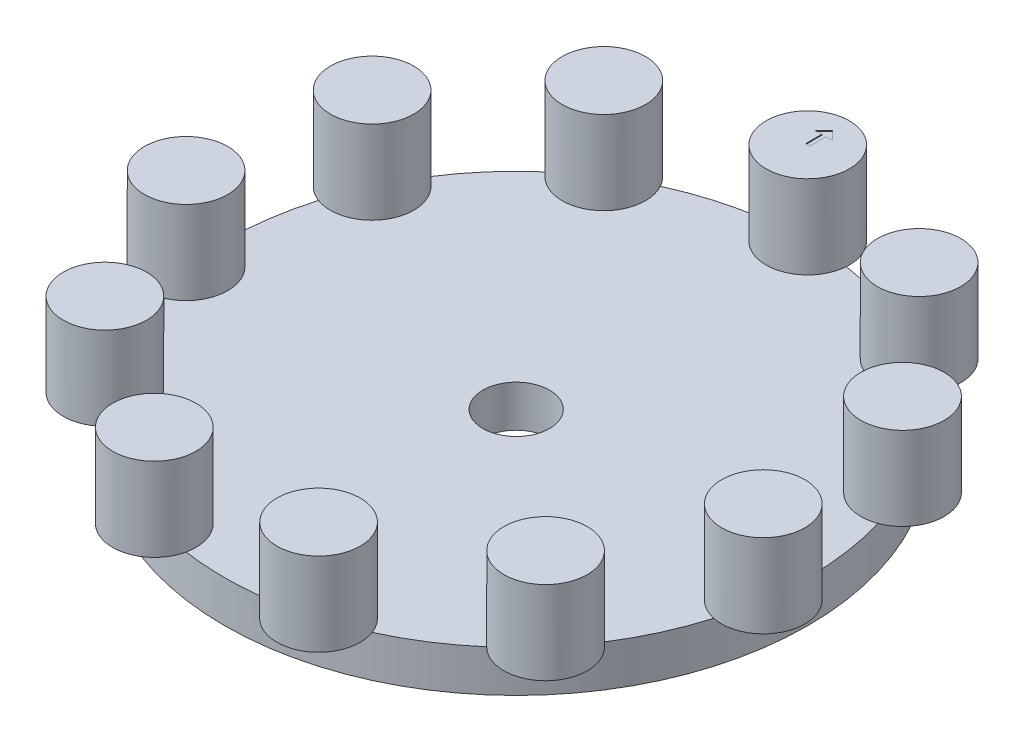
ISO-10303-21;
HEADER;
FILE_DESCRIPTION(('STEP AP214'),'2;1');
FILE_NAME('part.step','',(''),(''),'','','');
FILE_SCHEMA(('AUTOMOTIVE_DESIGN { 1 0 10303 214 1 1 1 1 }'));
ENDSEC;
DATA;
#1=APPLICATION_CONTEXT('core data for automotive mechanical design processes');
#2=APPLICATION_PROTOCOL_DEFINITION('international standard','automotive_design',2000,#1);
#3=PRODUCT_CONTEXT('',#1,'mechanical');
#4=PRODUCT('Part','Part','',(#3));
#5=PRODUCT_RELATED_PRODUCT_CATEGORY('part','',(#4));
#6=PRODUCT_DEFINITION_FORMATION('','',#4);
#7=PRODUCT_DEFINITION_CONTEXT('part definition',#1,'design');
#8=PRODUCT_DEFINITION('design','',#6,#7);
#9=PRODUCT_DEFINITION_SHAPE('','',#8);
#10=(LENGTH_UNIT() NAMED_UNIT(*) SI_UNIT(.MILLI.,.METRE.));
#11=(NAMED_UNIT(*) PLANE_ANGLE_UNIT() SI_UNIT($,.RADIAN.));
#12=(NAMED_UNIT(*) SI_UNIT($,.STERADIAN.) SOLID_ANGLE_UNIT());
#13=UNCERTAINTY_MEASURE_WITH_UNIT(LENGTH_MEASURE(1.E-05),#10,'distance_accuracy_value','');
#14=(GEOMETRIC_REPRESENTATION_CONTEXT(3) GLOBAL_UNCERTAINTY_ASSIGNED_CONTEXT((#13)) GLOBAL_UNIT_ASSIGNED_CONTEXT((#10,
#11,#12)) REPRESENTATION_CONTEXT('',''));
#15=CARTESIAN_POINT('',(0.,0.,0.));
#16=DIRECTION('',(0.,0.,1.));
#17=DIRECTION('',(1.,0.,0.));
#18=AXIS2_PLACEMENT_3D('',#15,#16,#17);
#19=CARTESIAN_POINT('',(0.,10.,0.));
#20=DIRECTION('',(0.,1.,0.));
#21=DIRECTION('',(0.,0.,1.));
#22=AXIS2_PLACEMENT_3D('',#19,#20,#21);
#23=PLANE('',#22);
#24=CARTESIAN_POINT('',(0.,10.,-35.));
#25=DIRECTION('',(0.,1.,0.));
#26=DIRECTION('',(0.,0.,1.));
#27=AXIS2_PLACEMENT_3D('',#24,#25,#26);
#28=CIRCLE('',#27,5.);
#29=CARTESIAN_POINT('',(0.,10.,-30.));
#30=VERTEX_POINT('',#29);
#31=EDGE_CURVE('E11',#30,#30,#28,.T.);
#32=ORIENTED_EDGE('',*,*,#31,.T.);
#33=EDGE_LOOP('',(#32));
#34=FACE_BOUND('',#33,.T.);
#35=DIRECTION('',(0.,0.,-1.));
#36=VECTOR('',#35,1.);
#37=CARTESIAN_POINT('',(-0.25,10.,0.));
#38=LINE('',#37,#36);
#39=CARTESIAN_POINT('',(-0.25,10.,-35.));
#40=VERTEX_POINT('',#39);
#41=CARTESIAN_POINT('',(-0.25,10.,-36.9393398282202));
#42=VERTEX_POINT('',#41);
#43=EDGE_CURVE('E219',#40,#42,#38,.T.);
#44=ORIENTED_EDGE('',*,*,#43,.T.);
#45=DIRECTION('',(-1.,0.,0.));
#46=VECTOR('',#45,1.);
#47=CARTESIAN_POINT('',(0.,10.,-36.9393398282202));
#48=LINE('',#47,#46);
#49=CARTESIAN_POINT('',(-1.06066017177979,10.,-36.9393398282202));
#50=VERTEX_POINT('',#49);
#51=EDGE_CURVE('E62',#42,#50,#48,.T.);
#52=ORIENTED_EDGE('',*,*,#51,.T.);
#53=DIRECTION('',(0.707106781186542,0.,-0.707106781186553));
#54=VECTOR('',#53,1.);
#55=CARTESIAN_POINT('',(-19.,10.,-18.9999999999997));
#56=LINE('',#55,#54);
#57=CARTESIAN_POINT('',(0.,10.,-38.));
#58=VERTEX_POINT('',#57);
#59=EDGE_CURVE('E196',#50,#58,#56,.T.);
#60=ORIENTED_EDGE('',*,*,#59,.T.);
#61=DIRECTION('',(0.707106781186554,0.,0.707106781186541));
#62=VECTOR('',#61,1.);
#63=CARTESIAN_POINT('',(19.,10.,-19.0000000000003));
#64=LINE('',#63,#62);
#65=CARTESIAN_POINT('',(1.06066017177983,10.,-36.9393398282202));
#66=VERTEX_POINT('',#65);
#67=EDGE_CURVE('E200',#58,#66,#64,.T.);
#68=ORIENTED_EDGE('',*,*,#67,.T.);
#69=DIRECTION('',(-1.,0.,0.));
#70=VECTOR('',#69,1.);
#71=CARTESIAN_POINT('',(0.,10.,-36.9393398282202));
#72=LINE('',#71,#70);
#73=CARTESIAN_POINT('',(0.25,10.,-36.9393398282202));
#74=VERTEX_POINT('',#73);
#75=EDGE_CURVE('E230',#66,#74,#72,.T.);
#76=ORIENTED_EDGE('',*,*,#75,.T.);
#77=DIRECTION('',(0.,0.,-1.));
#78=VECTOR('',#77,1.);
#79=CARTESIAN_POINT('',(0.25,10.,0.));
#80=LINE('',#79,#78);
#81=CARTESIAN_POINT('',(0.25,10.,-35.));
#82=VERTEX_POINT('',#81);
#83=EDGE_CURVE('E226',#82,#74,#80,.T.);
#84=ORIENTED_EDGE('',*,*,#83,.F.);
#85=DIRECTION('',(1.,0.,0.));
#86=VECTOR('',#85,1.);
#87=CARTESIAN_POINT('',(0.,10.,-35.));
#88=LINE('',#87,#86);
#89=EDGE_CURVE('E222',#40,#82,#88,.T.);
#90=ORIENTED_EDGE('',*,*,#89,.F.);
#91=EDGE_LOOP('',(#44,#52,#60,#68,#76,#84,#90));
#92=FACE_BOUND('',#91,.T.);
#93=ADVANCED_FACE('F46',(#34,#92),#23,.T.);
#94=CARTESIAN_POINT('',(0.,10.,-35.));
#95=DIRECTION('',(0.,-1.,0.));
#96=DIRECTION('',(0.,0.,-1.));
#97=AXIS2_PLACEMENT_3D('',#94,#95,#96);
#98=CYLINDRICAL_SURFACE('',#97,5.);
#99=ORIENTED_EDGE('',*,*,#31,.F.);
#100=EDGE_LOOP('',(#99));
#101=FACE_BOUND('',#100,.T.);
#102=CARTESIAN_POINT('',(0.,0.,-35.));
#103=DIRECTION('',(0.,1.,0.));
#104=DIRECTION('',(0.,0.,1.));
#105=AXIS2_PLACEMENT_3D('',#102,#103,#104);
#106=CIRCLE('',#105,5.);
#107=CARTESIAN_POINT('',(4.98722858706045,0.,-34.6428571428587));
#108=VERTEX_POINT('',#107);
#109=CARTESIAN_POINT('',(-4.98722858706045,0.,-34.6428571428587));
#110=VERTEX_POINT('',#109);
#111=EDGE_CURVE('E50',#108,#110,#106,.T.);
#112=ORIENTED_EDGE('',*,*,#111,.T.);
#113=EDGE_CURVE('E357',#110,#108,#106,.T.);
#114=ORIENTED_EDGE('',*,*,#113,.T.);
#115=EDGE_LOOP('',(#112,#114));
#116=FACE_BOUND('',#115,.T.);
#117=ADVANCED_FACE('F48',(#101,#116),#98,.T.);
#118=CARTESIAN_POINT('',(0.,0.,0.));
#119=DIRECTION('',(0.,1.,0.));
#120=DIRECTION('',(0.,0.,1.));
#121=AXIS2_PLACEMENT_3D('',#118,#119,#120);
#122=PLANE('',#121);
#123=ORIENTED_EDGE('',*,*,#111,.F.);
#124=CARTESIAN_POINT('',(0.,0.,0.));
#125=DIRECTION('',(0.,1.,0.));
#126=DIRECTION('',(0.,0.,1.));
#127=AXIS2_PLACEMENT_3D('',#124,#125,#126);
#128=CIRCLE('',#127,35.0000000000015);
#129=EDGE_CURVE('E358',#108,#110,#128,.T.);
#130=ORIENTED_EDGE('',*,*,#129,.T.);
#131=EDGE_LOOP('',(#123,#130));
#132=FACE_BOUND('',#131,.T.);
#133=ADVANCED_FACE('F450',(#132),#122,.F.);
#134=CARTESIAN_POINT('',(0.,0.,0.));
#135=DIRECTION('',(0.,1.,0.));
#136=DIRECTION('',(0.,0.,1.));
#137=AXIS2_PLACEMENT_3D('',#134,#135,#136);
#138=PLANE('',#137);
#139=CARTESIAN_POINT('',(0.,0.,0.));
#140=DIRECTION('',(0.,1.,0.));
#141=DIRECTION('',(0.,0.,1.));
#142=AXIS2_PLACEMENT_3D('',#139,#140,#141);
#143=CIRCLE('',#142,4.);
#144=CARTESIAN_POINT('',(0.,0.,4.));
#145=VERTEX_POINT('',#144);
#146=EDGE_CURVE('E340',#145,#145,#143,.T.);
#147=ORIENTED_EDGE('',*,*,#146,.F.);
#148=EDGE_LOOP('',(#147));
#149=FACE_BOUND('',#148,.T.);
#150=CARTESIAN_POINT('',(-14.5338189368116,0.,-31.8397252989419));
#151=VERTEX_POINT('',#150);
#152=EDGE_CURVE('E361',#110,#151,#128,.T.);
#153=ORIENTED_EDGE('',*,*,#152,.T.);
#154=CARTESIAN_POINT('',(-18.9224286109455,0.,-29.4438736490898));
#155=DIRECTION('',(0.,1.,0.));
#156=DIRECTION('',(0.,0.,1.));
#157=AXIS2_PLACEMENT_3D('',#154,#155,#156);
#158=CIRCLE('',#157,5.);
#159=CARTESIAN_POINT('',(-22.9248662726143,0.,-26.4471266186491));
#160=VERTEX_POINT('',#159);
#161=EDGE_CURVE('E240',#160,#151,#158,.T.);
#162=ORIENTED_EDGE('',*,*,#161,.F.);
#163=CARTESIAN_POINT('',(-29.4404816393038,0.,-18.9277056413588));
#164=VERTEX_POINT('',#163);
#165=EDGE_CURVE('E362',#160,#164,#128,.T.);
#166=ORIENTED_EDGE('',*,*,#165,.T.);
#167=CARTESIAN_POINT('',(-31.8371198374065,0.,-14.5395254550634));
#168=DIRECTION('',(0.,1.,0.));
#169=DIRECTION('',(0.,0.,1.));
#170=AXIS2_PLACEMENT_3D('',#167,#168,#169);
#171=CIRCLE('',#170,5.);
#172=CARTESIAN_POINT('',(-33.5840208959777,0.,-9.85462025948447));
#173=VERTEX_POINT('',#172);
#174=EDGE_CURVE('E259',#173,#164,#171,.T.);
#175=ORIENTED_EDGE('',*,*,#174,.F.);
#176=CARTESIAN_POINT('',(-34.999999437819,0.,-0.0062731794204891));
#177=VERTEX_POINT('',#176);
#178=EDGE_CURVE('E377',#173,#177,#128,.T.);
#179=ORIENTED_EDGE('',*,*,#178,.T.);
#180=CARTESIAN_POINT('',(-34.6437504658294,0.,4.98101933956779));
#181=DIRECTION('',(0.,1.,0.));
#182=DIRECTION('',(0.,0.,1.));
#183=AXIS2_PLACEMENT_3D('',#180,#181,#182);
#184=CIRCLE('',#183,5.);
#185=CARTESIAN_POINT('',(-33.5804861782192,0.,9.86665840264773));
#186=VERTEX_POINT('',#185);
#187=EDGE_CURVE('E278',#186,#177,#184,.T.);
#188=ORIENTED_EDGE('',*,*,#187,.F.);
#189=CARTESIAN_POINT('',(-29.4472647130037,0.,18.9171509726596));
#190=VERTEX_POINT('',#189);
#191=EDGE_CURVE('E379',#186,#190,#128,.T.);
#192=ORIENTED_EDGE('',*,*,#191,.T.);
#193=CARTESIAN_POINT('',(-26.4512351023944,0.,22.9201256880871));
#194=DIRECTION('',(0.,1.,0.));
#195=DIRECTION('',(0.,0.,1.));
#196=AXIS2_PLACEMENT_3D('',#193,#194,#195);
#197=CIRCLE('',#196,5.);
#198=CARTESIAN_POINT('',(-22.9153843672519,0.,26.4553427364156));
#199=VERTEX_POINT('',#198);
#200=EDGE_CURVE('E287',#199,#190,#197,.T.);
#201=ORIENTED_EDGE('',*,*,#200,.F.);
#202=CARTESIAN_POINT('',(-14.5452315062388,0.,31.8345133531208));
#203=VERTEX_POINT('',#202);
#204=EDGE_CURVE('E392',#199,#203,#128,.T.);
#205=ORIENTED_EDGE('',*,*,#204,.T.);
#206=CARTESIAN_POINT('',(-9.86063948944448,0.,33.5822540765082));
#207=DIRECTION('',(0.,1.,0.));
#208=DIRECTION('',(0.,0.,1.));
#209=AXIS2_PLACEMENT_3D('',#206,#207,#208);
#210=CIRCLE('',#209,5.);
#211=CARTESIAN_POINT('',(-4.97480993205055,0.,34.6446426758897));
#212=VERTEX_POINT('',#211);
#213=EDGE_CURVE('E296',#212,#203,#210,.T.);
#214=ORIENTED_EDGE('',*,*,#213,.F.);
#215=CARTESIAN_POINT('',(4.97480993206165,0.,34.6446426758881));
#216=VERTEX_POINT('',#215);
#217=EDGE_CURVE('E394',#212,#216,#128,.T.);
#218=ORIENTED_EDGE('',*,*,#217,.T.);
#219=CARTESIAN_POINT('',(9.86063948945559,0.,33.5822540765066));
#220=DIRECTION('',(0.,1.,0.));
#221=DIRECTION('',(0.,0.,1.));
#222=AXIS2_PLACEMENT_3D('',#219,#220,#221);
#223=CIRCLE('',#222,5.00000000000001);
#224=CARTESIAN_POINT('',(14.5452315062488,0.,31.8345133531162));
#225=VERTEX_POINT('',#224);
#226=EDGE_CURVE('E305',#225,#216,#223,.T.);
#227=ORIENTED_EDGE('',*,*,#226,.F.);
#228=CARTESIAN_POINT('',(22.9153843672592,0.,26.4553427364093));
#229=VERTEX_POINT('',#228);
#230=EDGE_CURVE('E408',#225,#229,#128,.T.);
#231=ORIENTED_EDGE('',*,*,#230,.T.);
#232=CARTESIAN_POINT('',(26.4512351024037,0.,22.9201256880828));
#233=DIRECTION('',(0.,1.,0.));
#234=DIRECTION('',(0.,0.,1.));
#235=AXIS2_PLACEMENT_3D('',#232,#233,#234);
#236=CIRCLE('',#235,5.);
#237=CARTESIAN_POINT('',(29.4472647130086,0.,18.917150972652));
#238=VERTEX_POINT('',#237);
#239=EDGE_CURVE('E314',#238,#229,#236,.T.);
#240=ORIENTED_EDGE('',*,*,#239,.F.);
#241=CARTESIAN_POINT('',(33.5804861782211,0.,9.86665840264113));
#242=VERTEX_POINT('',#241);
#243=EDGE_CURVE('E410',#238,#242,#128,.T.);
#244=ORIENTED_EDGE('',*,*,#243,.T.);
#245=CARTESIAN_POINT('',(34.6437504658359,0.,4.98101933956217));
#246=DIRECTION('',(0.,1.,0.));
#247=DIRECTION('',(0.,0.,1.));
#248=AXIS2_PLACEMENT_3D('',#245,#246,#247);
#249=CIRCLE('',#248,5.);
#250=CARTESIAN_POINT('',(34.999999437819,0.,-0.00627317942655803));
#251=VERTEX_POINT('',#250);
#252=EDGE_CURVE('E323',#251,#242,#249,.T.);
#253=ORIENTED_EDGE('',*,*,#252,.F.);
#254=CARTESIAN_POINT('',(33.5840208959766,0.,-9.85462025948802));
#255=VERTEX_POINT('',#254);
#256=EDGE_CURVE('E424',#251,#255,#128,.T.);
#257=ORIENTED_EDGE('',*,*,#256,.T.);
#258=CARTESIAN_POINT('',(31.8371198374098,0.,-14.5395254550686));
#259=DIRECTION('',(0.,1.,0.));
#260=DIRECTION('',(0.,0.,1.));
#261=AXIS2_PLACEMENT_3D('',#258,#259,#260);
#262=CIRCLE('',#261,4.99999999999999);
#263=CARTESIAN_POINT('',(29.4404816393022,0.,-18.9277056413613));
#264=VERTEX_POINT('',#263);
#265=EDGE_CURVE('E322',#264,#255,#262,.T.);
#266=ORIENTED_EDGE('',*,*,#265,.F.);
#267=CARTESIAN_POINT('',(22.9248662726135,0.,-26.4471266186499));
#268=VERTEX_POINT('',#267);
#269=EDGE_CURVE('E426',#264,#268,#128,.T.);
#270=ORIENTED_EDGE('',*,*,#269,.T.);
#271=CARTESIAN_POINT('',(18.9224286109464,0.,-29.4438736490929));
#272=DIRECTION('',(0.,1.,0.));
#273=DIRECTION('',(0.,0.,1.));
#274=AXIS2_PLACEMENT_3D('',#271,#272,#273);
#275=CIRCLE('',#274,5.);
#276=CARTESIAN_POINT('',(14.5338189368111,0.,-31.8397252989422));
#277=VERTEX_POINT('',#276);
#278=EDGE_CURVE('E331',#277,#268,#275,.T.);
#279=ORIENTED_EDGE('',*,*,#278,.F.);
#280=EDGE_CURVE('E349',#277,#108,#128,.T.);
#281=ORIENTED_EDGE('',*,*,#280,.T.);
#282=ORIENTED_EDGE('',*,*,#113,.F.);
#283=EDGE_LOOP('',(#153,#162,#166,#175,#179,#188,#192,#201,#205,#214,#218,#227,#231,#240,#244,
#253,#257,#266,#270,#279,#281,#282));
#284=FACE_BOUND('',#283,.T.);
#285=ADVANCED_FACE('F444',(#149,#284),#138,.T.);
#286=CARTESIAN_POINT('',(0.,-5.,0.));
#287=DIRECTION('',(0.,1.,0.));
#288=DIRECTION('',(0.,0.,1.));
#289=AXIS2_PLACEMENT_3D('',#286,#287,#288);
#290=CYLINDRICAL_SURFACE('',#289,35.0000000000015);
#291=CARTESIAN_POINT('',(0.,-5.,0.));
#292=DIRECTION('',(0.,1.,0.));
#293=DIRECTION('',(0.,0.,1.));
#294=AXIS2_PLACEMENT_3D('',#291,#292,#293);
#295=CIRCLE('',#294,35.0000000000015);
#296=CARTESIAN_POINT('',(0.,-5.,35.0000000000015));
#297=VERTEX_POINT('',#296);
#298=EDGE_CURVE('E353',#297,#297,#295,.T.);
#299=ORIENTED_EDGE('',*,*,#298,.T.);
#300=EDGE_LOOP('',(#299));
#301=FACE_BOUND('',#300,.T.);
#302=ORIENTED_EDGE('',*,*,#129,.F.);
#303=ORIENTED_EDGE('',*,*,#280,.F.);
#304=EDGE_CURVE('E368',#268,#277,#128,.T.);
#305=ORIENTED_EDGE('',*,*,#304,.F.);
#306=ORIENTED_EDGE('',*,*,#269,.F.);
#307=EDGE_CURVE('E431',#255,#264,#128,.T.);
#308=ORIENTED_EDGE('',*,*,#307,.F.);
#309=ORIENTED_EDGE('',*,*,#256,.F.);
#310=EDGE_CURVE('E417',#242,#251,#128,.T.);
#311=ORIENTED_EDGE('',*,*,#310,.F.);
#312=ORIENTED_EDGE('',*,*,#243,.F.);
#313=EDGE_CURVE('E415',#229,#238,#128,.T.);
#314=ORIENTED_EDGE('',*,*,#313,.F.);
#315=ORIENTED_EDGE('',*,*,#230,.F.);
#316=EDGE_CURVE('E401',#216,#225,#128,.T.);
#317=ORIENTED_EDGE('',*,*,#316,.F.);
#318=ORIENTED_EDGE('',*,*,#217,.F.);
#319=EDGE_CURVE('E399',#203,#212,#128,.T.);
#320=ORIENTED_EDGE('',*,*,#319,.F.);
#321=ORIENTED_EDGE('',*,*,#204,.F.);
#322=EDGE_CURVE('E385',#190,#199,#128,.T.);
#323=ORIENTED_EDGE('',*,*,#322,.F.);
#324=ORIENTED_EDGE('',*,*,#191,.F.);
#325=EDGE_CURVE('E383',#177,#186,#128,.T.);
#326=ORIENTED_EDGE('',*,*,#325,.F.);
#327=ORIENTED_EDGE('',*,*,#178,.F.);
#328=EDGE_CURVE('E370',#164,#173,#128,.T.);
#329=ORIENTED_EDGE('',*,*,#328,.F.);
#330=ORIENTED_EDGE('',*,*,#165,.F.);
#331=EDGE_CURVE('E70',#151,#160,#128,.T.);
#332=ORIENTED_EDGE('',*,*,#331,.F.);
#333=ORIENTED_EDGE('',*,*,#152,.F.);
#334=EDGE_LOOP('',(#302,#303,#305,#306,#308,#309,#311,#312,#314,#315,#317,#318,#320,#321,#323,
#324,#326,#327,#329,#330,#332,#333));
#335=FACE_BOUND('',#334,.T.);
#336=ADVANCED_FACE('F447',(#301,#335),#290,.T.);
#337=CARTESIAN_POINT('',(0.,-5.,0.));
#338=DIRECTION('',(0.,1.,0.));
#339=DIRECTION('',(0.,0.,1.));
#340=AXIS2_PLACEMENT_3D('',#337,#338,#339);
#341=PLANE('',#340);
#342=CARTESIAN_POINT('',(0.,-5.,0.));
#343=DIRECTION('',(0.,1.,0.));
#344=DIRECTION('',(0.,0.,1.));
#345=AXIS2_PLACEMENT_3D('',#342,#343,#344);
#346=CIRCLE('',#345,4.);
#347=CARTESIAN_POINT('',(0.,-5.,4.));
#348=VERTEX_POINT('',#347);
#349=EDGE_CURVE('E345',#348,#348,#346,.T.);
#350=ORIENTED_EDGE('',*,*,#349,.T.);
#351=EDGE_LOOP('',(#350));
#352=FACE_BOUND('',#351,.T.);
#353=ORIENTED_EDGE('',*,*,#298,.F.);
#354=EDGE_LOOP('',(#353));
#355=FACE_BOUND('',#354,.T.);
#356=ADVANCED_FACE('F470',(#352,#355),#341,.F.);
#357=CARTESIAN_POINT('',(0.,-5.,0.));
#358=DIRECTION('',(0.,1.,0.));
#359=DIRECTION('',(0.,0.,1.));
#360=AXIS2_PLACEMENT_3D('',#357,#358,#359);
#361=CYLINDRICAL_SURFACE('',#360,4.);
#362=ORIENTED_EDGE('',*,*,#349,.F.);
#363=EDGE_LOOP('',(#362));
#364=FACE_BOUND('',#363,.T.);
#365=ORIENTED_EDGE('',*,*,#146,.T.);
#366=EDGE_LOOP('',(#365));
#367=FACE_BOUND('',#366,.T.);
#368=ADVANCED_FACE('F475',(#364,#367),#361,.F.);
#369=CARTESIAN_POINT('',(18.9224286109464,10.,-29.4438736490929));
#370=DIRECTION('',(0.,-1.,0.));
#371=DIRECTION('',(0.,0.,-1.));
#372=AXIS2_PLACEMENT_3D('',#369,#370,#371);
#373=CYLINDRICAL_SURFACE('',#372,5.);
#374=CARTESIAN_POINT('',(18.9224286109464,10.,-29.4438736490929));
#375=DIRECTION('',(0.,1.,0.));
#376=DIRECTION('',(0.,0.,1.));
#377=AXIS2_PLACEMENT_3D('',#374,#375,#376);
#378=CIRCLE('',#377,5.);
#379=CARTESIAN_POINT('',(18.9224286109464,10.,-24.4438736490929));
#380=VERTEX_POINT('',#379);
#381=EDGE_CURVE('E336',#380,#380,#378,.T.);
#382=ORIENTED_EDGE('',*,*,#381,.F.);
#383=EDGE_LOOP('',(#382));
#384=FACE_BOUND('',#383,.T.);
#385=EDGE_CURVE('E341',#268,#277,#275,.T.);
#386=ORIENTED_EDGE('',*,*,#385,.T.);
#387=ORIENTED_EDGE('',*,*,#278,.T.);
#388=EDGE_LOOP('',(#386,#387));
#389=FACE_BOUND('',#388,.T.);
#390=ADVANCED_FACE('F479',(#384,#389),#373,.T.);
#391=CARTESIAN_POINT('',(0.,10.,0.));
#392=DIRECTION('',(0.,1.,0.));
#393=DIRECTION('',(0.,0.,1.));
#394=AXIS2_PLACEMENT_3D('',#391,#392,#393);
#395=PLANE('',#394);
#396=ORIENTED_EDGE('',*,*,#381,.T.);
#397=EDGE_LOOP('',(#396));
#398=FACE_BOUND('',#397,.T.);
#399=ADVANCED_FACE('F483',(#398),#395,.T.);
#400=CARTESIAN_POINT('',(0.,0.,0.));
#401=DIRECTION('',(0.,1.,0.));
#402=DIRECTION('',(0.,0.,1.));
#403=AXIS2_PLACEMENT_3D('',#400,#401,#402);
#404=PLANE('',#403);
#405=ORIENTED_EDGE('',*,*,#304,.T.);
#406=ORIENTED_EDGE('',*,*,#385,.F.);
#407=EDGE_LOOP('',(#405,#406));
#408=FACE_BOUND('',#407,.T.);
#409=ADVANCED_FACE('F485',(#408),#404,.F.);
#410=CARTESIAN_POINT('',(31.8371198374098,10.,-14.5395254550686));
#411=DIRECTION('',(0.,-1.,0.));
#412=DIRECTION('',(0.,0.,-1.));
#413=AXIS2_PLACEMENT_3D('',#410,#411,#412);
#414=CYLINDRICAL_SURFACE('',#413,4.99999999999999);
#415=CARTESIAN_POINT('',(31.8371198374098,10.,-14.5395254550686));
#416=DIRECTION('',(0.,1.,0.));
#417=DIRECTION('',(0.,0.,1.));
#418=AXIS2_PLACEMENT_3D('',#415,#416,#417);
#419=CIRCLE('',#418,4.99999999999999);
#420=CARTESIAN_POINT('',(31.8371198374098,10.,-9.53952545506861));
#421=VERTEX_POINT('',#420);
#422=EDGE_CURVE('E327',#421,#421,#419,.T.);
#423=ORIENTED_EDGE('',*,*,#422,.F.);
#424=EDGE_LOOP('',(#423));
#425=FACE_BOUND('',#424,.T.);
#426=EDGE_CURVE('E332',#255,#264,#262,.T.);
#427=ORIENTED_EDGE('',*,*,#426,.T.);
#428=ORIENTED_EDGE('',*,*,#265,.T.);
#429=EDGE_LOOP('',(#427,#428));
#430=FACE_BOUND('',#429,.T.);
#431=ADVANCED_FACE('F488',(#425,#430),#414,.T.);
#432=CARTESIAN_POINT('',(0.,10.,0.));
#433=DIRECTION('',(0.,1.,0.));
#434=DIRECTION('',(0.,0.,1.));
#435=AXIS2_PLACEMENT_3D('',#432,#433,#434);
#436=PLANE('',#435);
#437=ORIENTED_EDGE('',*,*,#422,.T.);
#438=EDGE_LOOP('',(#437));
#439=FACE_BOUND('',#438,.T.);
#440=ADVANCED_FACE('F494',(#439),#436,.T.);
#441=CARTESIAN_POINT('',(0.,0.,0.));
#442=DIRECTION('',(0.,1.,0.));
#443=DIRECTION('',(0.,0.,1.));
#444=AXIS2_PLACEMENT_3D('',#441,#442,#443);
#445=PLANE('',#444);
#446=ORIENTED_EDGE('',*,*,#307,.T.);
#447=ORIENTED_EDGE('',*,*,#426,.F.);
#448=EDGE_LOOP('',(#446,#447));
#449=FACE_BOUND('',#448,.T.);
#450=ADVANCED_FACE('F496',(#449),#445,.F.);
#451=CARTESIAN_POINT('',(34.6437504658359,10.,4.98101933956217));
#452=DIRECTION('',(0.,-1.,0.));
#453=DIRECTION('',(0.,0.,-1.));
#454=AXIS2_PLACEMENT_3D('',#451,#452,#453);
#455=CYLINDRICAL_SURFACE('',#454,5.);
#456=CARTESIAN_POINT('',(34.6437504658359,10.,4.98101933956217));
#457=DIRECTION('',(0.,1.,0.));
#458=DIRECTION('',(0.,0.,1.));
#459=AXIS2_PLACEMENT_3D('',#456,#457,#458);
#460=CIRCLE('',#459,5.);
#461=CARTESIAN_POINT('',(34.6437504658359,10.,9.98101933956217));
#462=VERTEX_POINT('',#461);
#463=EDGE_CURVE('E318',#462,#462,#460,.T.);
#464=ORIENTED_EDGE('',*,*,#463,.F.);
#465=EDGE_LOOP('',(#464));
#466=FACE_BOUND('',#465,.T.);
#467=ORIENTED_EDGE('',*,*,#252,.T.);
#468=EDGE_CURVE('E313',#242,#251,#249,.T.);
#469=ORIENTED_EDGE('',*,*,#468,.T.);
#470=EDGE_LOOP('',(#467,#469));
#471=FACE_BOUND('',#470,.T.);
#472=ADVANCED_FACE('F499',(#466,#471),#455,.T.);
#473=CARTESIAN_POINT('',(0.,10.,0.));
#474=DIRECTION('',(0.,1.,0.));
#475=DIRECTION('',(0.,0.,1.));
#476=AXIS2_PLACEMENT_3D('',#473,#474,#475);
#477=PLANE('',#476);
#478=ORIENTED_EDGE('',*,*,#463,.T.);
#479=EDGE_LOOP('',(#478));
#480=FACE_BOUND('',#479,.T.);
#481=ADVANCED_FACE('F506',(#480),#477,.T.);
#482=CARTESIAN_POINT('',(0.,0.,0.));
#483=DIRECTION('',(0.,1.,0.));
#484=DIRECTION('',(0.,0.,1.));
#485=AXIS2_PLACEMENT_3D('',#482,#483,#484);
#486=PLANE('',#485);
#487=ORIENTED_EDGE('',*,*,#310,.T.);
#488=ORIENTED_EDGE('',*,*,#468,.F.);
#489=EDGE_LOOP('',(#487,#488));
#490=FACE_BOUND('',#489,.T.);
#491=ADVANCED_FACE('F508',(#490),#486,.F.);
#492=CARTESIAN_POINT('',(26.4512351024037,10.,22.9201256880828));
#493=DIRECTION('',(0.,-1.,0.));
#494=DIRECTION('',(0.,0.,-1.));
#495=AXIS2_PLACEMENT_3D('',#492,#493,#494);
#496=CYLINDRICAL_SURFACE('',#495,5.);
#497=CARTESIAN_POINT('',(26.4512351024037,10.,22.9201256880828));
#498=DIRECTION('',(0.,1.,0.));
#499=DIRECTION('',(0.,0.,1.));
#500=AXIS2_PLACEMENT_3D('',#497,#498,#499);
#501=CIRCLE('',#500,5.);
#502=CARTESIAN_POINT('',(26.4512351024037,10.,27.9201256880828));
#503=VERTEX_POINT('',#502);
#504=EDGE_CURVE('E309',#503,#503,#501,.T.);
#505=ORIENTED_EDGE('',*,*,#504,.F.);
#506=EDGE_LOOP('',(#505));
#507=FACE_BOUND('',#506,.T.);
#508=ORIENTED_EDGE('',*,*,#239,.T.);
#509=EDGE_CURVE('E304',#229,#238,#236,.T.);
#510=ORIENTED_EDGE('',*,*,#509,.T.);
#511=EDGE_LOOP('',(#508,#510));
#512=FACE_BOUND('',#511,.T.);
#513=ADVANCED_FACE('F511',(#507,#512),#496,.T.);
#514=CARTESIAN_POINT('',(0.,10.,0.));
#515=DIRECTION('',(0.,1.,0.));
#516=DIRECTION('',(0.,0.,1.));
#517=AXIS2_PLACEMENT_3D('',#514,#515,#516);
#518=PLANE('',#517);
#519=ORIENTED_EDGE('',*,*,#504,.T.);
#520=EDGE_LOOP('',(#519));
#521=FACE_BOUND('',#520,.T.);
#522=ADVANCED_FACE('F517',(#521),#518,.T.);
#523=CARTESIAN_POINT('',(0.,0.,0.));
#524=DIRECTION('',(0.,1.,0.));
#525=DIRECTION('',(0.,0.,1.));
#526=AXIS2_PLACEMENT_3D('',#523,#524,#525);
#527=PLANE('',#526);
#528=ORIENTED_EDGE('',*,*,#313,.T.);
#529=ORIENTED_EDGE('',*,*,#509,.F.);
#530=EDGE_LOOP('',(#528,#529));
#531=FACE_BOUND('',#530,.T.);
#532=ADVANCED_FACE('F519',(#531),#527,.F.);
#533=CARTESIAN_POINT('',(9.86063948945559,10.,33.5822540765066));
#534=DIRECTION('',(0.,-1.,0.));
#535=DIRECTION('',(0.,0.,-1.));
#536=AXIS2_PLACEMENT_3D('',#533,#534,#535);
#537=CYLINDRICAL_SURFACE('',#536,5.00000000000001);
#538=CARTESIAN_POINT('',(9.86063948945559,10.,33.5822540765066));
#539=DIRECTION('',(0.,1.,0.));
#540=DIRECTION('',(0.,0.,1.));
#541=AXIS2_PLACEMENT_3D('',#538,#539,#540);
#542=CIRCLE('',#541,5.00000000000001);
#543=CARTESIAN_POINT('',(9.86063948945559,10.,38.5822540765066));
#544=VERTEX_POINT('',#543);
#545=EDGE_CURVE('E300',#544,#544,#542,.T.);
#546=ORIENTED_EDGE('',*,*,#545,.F.);
#547=EDGE_LOOP('',(#546));
#548=FACE_BOUND('',#547,.T.);
#549=ORIENTED_EDGE('',*,*,#226,.T.);
#550=EDGE_CURVE('E295',#216,#225,#223,.T.);
#551=ORIENTED_EDGE('',*,*,#550,.T.);
#552=EDGE_LOOP('',(#549,#551));
#553=FACE_BOUND('',#552,.T.);
#554=ADVANCED_FACE('F522',(#548,#553),#537,.T.);
#555=CARTESIAN_POINT('',(0.,10.,0.));
#556=DIRECTION('',(0.,1.,0.));
#557=DIRECTION('',(0.,0.,1.));
#558=AXIS2_PLACEMENT_3D('',#555,#556,#557);
#559=PLANE('',#558);
#560=ORIENTED_EDGE('',*,*,#545,.T.);
#561=EDGE_LOOP('',(#560));
#562=FACE_BOUND('',#561,.T.);
#563=ADVANCED_FACE('F529',(#562),#559,.T.);
#564=CARTESIAN_POINT('',(0.,0.,0.));
#565=DIRECTION('',(0.,1.,0.));
#566=DIRECTION('',(0.,0.,1.));
#567=AXIS2_PLACEMENT_3D('',#564,#565,#566);
#568=PLANE('',#567);
#569=ORIENTED_EDGE('',*,*,#316,.T.);
#570=ORIENTED_EDGE('',*,*,#550,.F.);
#571=EDGE_LOOP('',(#569,#570));
#572=FACE_BOUND('',#571,.T.);
#573=ADVANCED_FACE('F531',(#572),#568,.F.);
#574=CARTESIAN_POINT('',(-9.86063948944448,10.,33.5822540765082));
#575=DIRECTION('',(0.,-1.,0.));
#576=DIRECTION('',(0.,0.,-1.));
#577=AXIS2_PLACEMENT_3D('',#574,#575,#576);
#578=CYLINDRICAL_SURFACE('',#577,5.);
#579=CARTESIAN_POINT('',(-9.86063948944448,10.,33.5822540765082));
#580=DIRECTION('',(0.,1.,0.));
#581=DIRECTION('',(0.,0.,1.));
#582=AXIS2_PLACEMENT_3D('',#579,#580,#581);
#583=CIRCLE('',#582,5.);
#584=CARTESIAN_POINT('',(-9.86063948944448,10.,38.5822540765082));
#585=VERTEX_POINT('',#584);
#586=EDGE_CURVE('E291',#585,#585,#583,.T.);
#587=ORIENTED_EDGE('',*,*,#586,.F.);
#588=EDGE_LOOP('',(#587));
#589=FACE_BOUND('',#588,.T.);
#590=ORIENTED_EDGE('',*,*,#213,.T.);
#591=EDGE_CURVE('E286',#203,#212,#210,.T.);
#592=ORIENTED_EDGE('',*,*,#591,.T.);
#593=EDGE_LOOP('',(#590,#592));
#594=FACE_BOUND('',#593,.T.);
#595=ADVANCED_FACE('F534',(#589,#594),#578,.T.);
#596=CARTESIAN_POINT('',(0.,10.,0.));
#597=DIRECTION('',(0.,1.,0.));
#598=DIRECTION('',(0.,0.,1.));
#599=AXIS2_PLACEMENT_3D('',#596,#597,#598);
#600=PLANE('',#599);
#601=ORIENTED_EDGE('',*,*,#586,.T.);
#602=EDGE_LOOP('',(#601));
#603=FACE_BOUND('',#602,.T.);
#604=ADVANCED_FACE('F540',(#603),#600,.T.);
#605=CARTESIAN_POINT('',(0.,0.,0.));
#606=DIRECTION('',(0.,1.,0.));
#607=DIRECTION('',(0.,0.,1.));
#608=AXIS2_PLACEMENT_3D('',#605,#606,#607);
#609=PLANE('',#608);
#610=ORIENTED_EDGE('',*,*,#319,.T.);
#611=ORIENTED_EDGE('',*,*,#591,.F.);
#612=EDGE_LOOP('',(#610,#611));
#613=FACE_BOUND('',#612,.T.);
#614=ADVANCED_FACE('F542',(#613),#609,.F.);
#615=CARTESIAN_POINT('',(-26.4512351023944,10.,22.9201256880871));
#616=DIRECTION('',(0.,-1.,0.));
#617=DIRECTION('',(0.,0.,-1.));
#618=AXIS2_PLACEMENT_3D('',#615,#616,#617);
#619=CYLINDRICAL_SURFACE('',#618,5.);
#620=CARTESIAN_POINT('',(-26.4512351023944,10.,22.9201256880871));
#621=DIRECTION('',(0.,1.,0.));
#622=DIRECTION('',(0.,0.,1.));
#623=AXIS2_PLACEMENT_3D('',#620,#621,#622);
#624=CIRCLE('',#623,5.);
#625=CARTESIAN_POINT('',(-26.4512351023944,10.,27.9201256880871));
#626=VERTEX_POINT('',#625);
#627=EDGE_CURVE('E282',#626,#626,#624,.T.);
#628=ORIENTED_EDGE('',*,*,#627,.F.);
#629=EDGE_LOOP('',(#628));
#630=FACE_BOUND('',#629,.T.);
#631=ORIENTED_EDGE('',*,*,#200,.T.);
#632=EDGE_CURVE('E277',#190,#199,#197,.T.);
#633=ORIENTED_EDGE('',*,*,#632,.T.);
#634=EDGE_LOOP('',(#631,#633));
#635=FACE_BOUND('',#634,.T.);
#636=ADVANCED_FACE('F545',(#630,#635),#619,.T.);
#637=CARTESIAN_POINT('',(0.,10.,0.));
#638=DIRECTION('',(0.,1.,0.));
#639=DIRECTION('',(0.,0.,1.));
#640=AXIS2_PLACEMENT_3D('',#637,#638,#639);
#641=PLANE('',#640);
#642=ORIENTED_EDGE('',*,*,#627,.T.);
#643=EDGE_LOOP('',(#642));
#644=FACE_BOUND('',#643,.T.);
#645=ADVANCED_FACE('F552',(#644),#641,.T.);
#646=CARTESIAN_POINT('',(0.,0.,0.));
#647=DIRECTION('',(0.,1.,0.));
#648=DIRECTION('',(0.,0.,1.));
#649=AXIS2_PLACEMENT_3D('',#646,#647,#648);
#650=PLANE('',#649);
#651=ORIENTED_EDGE('',*,*,#322,.T.);
#652=ORIENTED_EDGE('',*,*,#632,.F.);
#653=EDGE_LOOP('',(#651,#652));
#654=FACE_BOUND('',#653,.T.);
#655=ADVANCED_FACE('F554',(#654),#650,.F.);
#656=CARTESIAN_POINT('',(-34.6437504658294,10.,4.98101933956779));
#657=DIRECTION('',(0.,-1.,0.));
#658=DIRECTION('',(0.,0.,-1.));
#659=AXIS2_PLACEMENT_3D('',#656,#657,#658);
#660=CYLINDRICAL_SURFACE('',#659,5.);
#661=CARTESIAN_POINT('',(-34.6437504658294,10.,4.98101933956779));
#662=DIRECTION('',(0.,1.,0.));
#663=DIRECTION('',(0.,0.,1.));
#664=AXIS2_PLACEMENT_3D('',#661,#662,#663);
#665=CIRCLE('',#664,5.);
#666=CARTESIAN_POINT('',(-34.6437504658294,10.,9.98101933956779));
#667=VERTEX_POINT('',#666);
#668=EDGE_CURVE('E273',#667,#667,#665,.T.);
#669=ORIENTED_EDGE('',*,*,#668,.F.);
#670=EDGE_LOOP('',(#669));
#671=FACE_BOUND('',#670,.T.);
#672=ORIENTED_EDGE('',*,*,#187,.T.);
#673=EDGE_CURVE('E268',#177,#186,#184,.T.);
#674=ORIENTED_EDGE('',*,*,#673,.T.);
#675=EDGE_LOOP('',(#672,#674));
#676=FACE_BOUND('',#675,.T.);
#677=ADVANCED_FACE('F557',(#671,#676),#660,.T.);
#678=CARTESIAN_POINT('',(0.,10.,0.));
#679=DIRECTION('',(0.,1.,0.));
#680=DIRECTION('',(0.,0.,1.));
#681=AXIS2_PLACEMENT_3D('',#678,#679,#680);
#682=PLANE('',#681);
#683=ORIENTED_EDGE('',*,*,#668,.T.);
#684=EDGE_LOOP('',(#683));
#685=FACE_BOUND('',#684,.T.);
#686=ADVANCED_FACE('F563',(#685),#682,.T.);
#687=CARTESIAN_POINT('',(0.,0.,0.));
#688=DIRECTION('',(0.,1.,0.));
#689=DIRECTION('',(0.,0.,1.));
#690=AXIS2_PLACEMENT_3D('',#687,#688,#689);
#691=PLANE('',#690);
#692=ORIENTED_EDGE('',*,*,#325,.T.);
#693=ORIENTED_EDGE('',*,*,#673,.F.);
#694=EDGE_LOOP('',(#692,#693));
#695=FACE_BOUND('',#694,.T.);
#696=ADVANCED_FACE('F565',(#695),#691,.F.);
#697=CARTESIAN_POINT('',(-31.8371198374065,10.,-14.5395254550634));
#698=DIRECTION('',(0.,-1.,0.));
#699=DIRECTION('',(0.,0.,-1.));
#700=AXIS2_PLACEMENT_3D('',#697,#698,#699);
#701=CYLINDRICAL_SURFACE('',#700,5.);
#702=CARTESIAN_POINT('',(-31.8371198374065,10.,-14.5395254550634));
#703=DIRECTION('',(0.,1.,0.));
#704=DIRECTION('',(0.,0.,1.));
#705=AXIS2_PLACEMENT_3D('',#702,#703,#704);
#706=CIRCLE('',#705,5.);
#707=CARTESIAN_POINT('',(-31.8371198374065,10.,-9.53952545506344));
#708=VERTEX_POINT('',#707);
#709=EDGE_CURVE('E264',#708,#708,#706,.T.);
#710=ORIENTED_EDGE('',*,*,#709,.F.);
#711=EDGE_LOOP('',(#710));
#712=FACE_BOUND('',#711,.T.);
#713=EDGE_CURVE('E269',#164,#173,#171,.T.);
#714=ORIENTED_EDGE('',*,*,#713,.T.);
#715=ORIENTED_EDGE('',*,*,#174,.T.);
#716=EDGE_LOOP('',(#714,#715));
#717=FACE_BOUND('',#716,.T.);
#718=ADVANCED_FACE('F568',(#712,#717),#701,.T.);
#719=CARTESIAN_POINT('',(0.,10.,0.));
#720=DIRECTION('',(0.,1.,0.));
#721=DIRECTION('',(0.,0.,1.));
#722=AXIS2_PLACEMENT_3D('',#719,#720,#721);
#723=PLANE('',#722);
#724=ORIENTED_EDGE('',*,*,#709,.T.);
#725=EDGE_LOOP('',(#724));
#726=FACE_BOUND('',#725,.T.);
#727=ADVANCED_FACE('F575',(#726),#723,.T.);
#728=CARTESIAN_POINT('',(0.,0.,0.));
#729=DIRECTION('',(0.,1.,0.));
#730=DIRECTION('',(0.,0.,1.));
#731=AXIS2_PLACEMENT_3D('',#728,#729,#730);
#732=PLANE('',#731);
#733=ORIENTED_EDGE('',*,*,#328,.T.);
#734=ORIENTED_EDGE('',*,*,#713,.F.);
#735=EDGE_LOOP('',(#733,#734));
#736=FACE_BOUND('',#735,.T.);
#737=ADVANCED_FACE('F577',(#736),#732,.F.);
#738=CARTESIAN_POINT('',(-18.9224286109455,10.,-29.4438736490898));
#739=DIRECTION('',(0.,-1.,0.));
#740=DIRECTION('',(0.,0.,-1.));
#741=AXIS2_PLACEMENT_3D('',#738,#739,#740);
#742=CYLINDRICAL_SURFACE('',#741,5.);
#743=CARTESIAN_POINT('',(-18.9224286109455,10.,-29.4438736490898));
#744=DIRECTION('',(0.,1.,0.));
#745=DIRECTION('',(0.,0.,1.));
#746=AXIS2_PLACEMENT_3D('',#743,#744,#745);
#747=CIRCLE('',#746,5.);
#748=CARTESIAN_POINT('',(-18.9224286109455,10.,-24.4438736490898));
#749=VERTEX_POINT('',#748);
#750=EDGE_CURVE('E255',#749,#749,#747,.T.);
#751=ORIENTED_EDGE('',*,*,#750,.F.);
#752=EDGE_LOOP('',(#751));
#753=FACE_BOUND('',#752,.T.);
#754=EDGE_CURVE('E260',#151,#160,#158,.T.);
#755=ORIENTED_EDGE('',*,*,#754,.T.);
#756=ORIENTED_EDGE('',*,*,#161,.T.);
#757=EDGE_LOOP('',(#755,#756));
#758=FACE_BOUND('',#757,.T.);
#759=ADVANCED_FACE('F580',(#753,#758),#742,.T.);
#760=CARTESIAN_POINT('',(0.,10.,0.));
#761=DIRECTION('',(0.,1.,0.));
#762=DIRECTION('',(0.,0.,1.));
#763=AXIS2_PLACEMENT_3D('',#760,#761,#762);
#764=PLANE('',#763);
#765=ORIENTED_EDGE('',*,*,#750,.T.);
#766=EDGE_LOOP('',(#765));
#767=FACE_BOUND('',#766,.T.);
#768=ADVANCED_FACE('F586',(#767),#764,.T.);
#769=CARTESIAN_POINT('',(0.,0.,0.));
#770=DIRECTION('',(0.,1.,0.));
#771=DIRECTION('',(0.,0.,1.));
#772=AXIS2_PLACEMENT_3D('',#769,#770,#771);
#773=PLANE('',#772);
#774=ORIENTED_EDGE('',*,*,#331,.T.);
#775=ORIENTED_EDGE('',*,*,#754,.F.);
#776=EDGE_LOOP('',(#774,#775));
#777=FACE_BOUND('',#776,.T.);
#778=ADVANCED_FACE('F588',(#777),#773,.F.);
#779=CARTESIAN_POINT('',(0.,9.9,-36.9393398282202));
#780=DIRECTION('',(0.,0.,-1.));
#781=DIRECTION('',(-1.,0.,0.));
#782=AXIS2_PLACEMENT_3D('',#779,#780,#781);
#783=PLANE('',#782);
#784=ORIENTED_EDGE('',*,*,#51,.F.);
#785=DIRECTION('',(0.,1.,0.));
#786=VECTOR('',#785,1.);
#787=CARTESIAN_POINT('',(-0.25,9.9,-36.9393398282202));
#788=LINE('',#787,#786);
#789=CARTESIAN_POINT('',(-0.25,9.9,-36.9393398282202));
#790=VERTEX_POINT('',#789);
#791=EDGE_CURVE('E176',#790,#42,#788,.T.);
#792=ORIENTED_EDGE('',*,*,#791,.F.);
#793=DIRECTION('',(-1.,0.,0.));
#794=VECTOR('',#793,1.);
#795=CARTESIAN_POINT('',(0.,9.9,-36.9393398282202));
#796=LINE('',#795,#794);
#797=CARTESIAN_POINT('',(-1.06066017177979,9.9,-36.9393398282202));
#798=VERTEX_POINT('',#797);
#799=EDGE_CURVE('E185',#790,#798,#796,.T.);
#800=ORIENTED_EDGE('',*,*,#799,.T.);
#801=DIRECTION('',(0.,1.,0.));
#802=VECTOR('',#801,1.);
#803=CARTESIAN_POINT('',(-1.06066017177979,9.9,-36.9393398282202));
#804=LINE('',#803,#802);
#805=EDGE_CURVE('E237',#798,#50,#804,.T.);
#806=ORIENTED_EDGE('',*,*,#805,.T.);
#807=EDGE_LOOP('',(#784,#792,#800,#806));
#808=FACE_BOUND('',#807,.T.);
#809=ADVANCED_FACE('F188',(#808),#783,.T.);
#810=CARTESIAN_POINT('',(-19.,9.9,-18.9999999999997));
#811=DIRECTION('',(0.707106781186553,0.,0.707106781186542));
#812=DIRECTION('',(0.707106781186542,0.,-0.707106781186553));
#813=AXIS2_PLACEMENT_3D('',#810,#811,#812);
#814=PLANE('',#813);
#815=ORIENTED_EDGE('',*,*,#59,.F.);
#816=ORIENTED_EDGE('',*,*,#805,.F.);
#817=DIRECTION('',(0.707106781186542,0.,-0.707106781186553));
#818=VECTOR('',#817,1.);
#819=CARTESIAN_POINT('',(-19.,9.9,-18.9999999999997));
#820=LINE('',#819,#818);
#821=CARTESIAN_POINT('',(0.,9.9,-38.));
#822=VERTEX_POINT('',#821);
#823=EDGE_CURVE('E191',#798,#822,#820,.T.);
#824=ORIENTED_EDGE('',*,*,#823,.T.);
#825=DIRECTION('',(0.,1.,0.));
#826=VECTOR('',#825,1.);
#827=CARTESIAN_POINT('',(0.,9.9,-38.));
#828=LINE('',#827,#826);
#829=EDGE_CURVE('E241',#822,#58,#828,.T.);
#830=ORIENTED_EDGE('',*,*,#829,.T.);
#831=EDGE_LOOP('',(#815,#816,#824,#830));
#832=FACE_BOUND('',#831,.T.);
#833=ADVANCED_FACE('F597',(#832),#814,.T.);
#834=CARTESIAN_POINT('',(19.,9.9,-19.0000000000003));
#835=DIRECTION('',(-0.707106781186541,0.,0.707106781186554));
#836=DIRECTION('',(0.707106781186554,0.,0.707106781186541));
#837=AXIS2_PLACEMENT_3D('',#834,#835,#836);
#838=PLANE('',#837);
#839=ORIENTED_EDGE('',*,*,#67,.F.);
#840=ORIENTED_EDGE('',*,*,#829,.F.);
#841=DIRECTION('',(0.707106781186554,0.,0.707106781186541));
#842=VECTOR('',#841,1.);
#843=CARTESIAN_POINT('',(19.,9.9,-19.0000000000003));
#844=LINE('',#843,#842);
#845=CARTESIAN_POINT('',(1.06066017177983,9.9,-36.9393398282202));
#846=VERTEX_POINT('',#845);
#847=EDGE_CURVE('E212',#822,#846,#844,.T.);
#848=ORIENTED_EDGE('',*,*,#847,.T.);
#849=DIRECTION('',(0.,1.,0.));
#850=VECTOR('',#849,1.);
#851=CARTESIAN_POINT('',(1.06066017177983,9.9,-36.9393398282202));
#852=LINE('',#851,#850);
#853=EDGE_CURVE('E244',#846,#66,#852,.T.);
#854=ORIENTED_EDGE('',*,*,#853,.T.);
#855=EDGE_LOOP('',(#839,#840,#848,#854));
#856=FACE_BOUND('',#855,.T.);
#857=ADVANCED_FACE('F611',(#856),#838,.T.);
#858=CARTESIAN_POINT('',(0.,9.9,-36.9393398282202));
#859=DIRECTION('',(0.,0.,-1.));
#860=DIRECTION('',(-1.,0.,0.));
#861=AXIS2_PLACEMENT_3D('',#858,#859,#860);
#862=PLANE('',#861);
#863=ORIENTED_EDGE('',*,*,#75,.F.);
#864=ORIENTED_EDGE('',*,*,#853,.F.);
#865=DIRECTION('',(-1.,0.,0.));
#866=VECTOR('',#865,1.);
#867=CARTESIAN_POINT('',(0.,9.9,-36.9393398282202));
#868=LINE('',#867,#866);
#869=CARTESIAN_POINT('',(0.25,9.9,-36.9393398282202));
#870=VERTEX_POINT('',#869);
#871=EDGE_CURVE('E209',#846,#870,#868,.T.);
#872=ORIENTED_EDGE('',*,*,#871,.T.);
#873=DIRECTION('',(0.,1.,0.));
#874=VECTOR('',#873,1.);
#875=CARTESIAN_POINT('',(0.25,9.9,-36.9393398282202));
#876=LINE('',#875,#874);
#877=EDGE_CURVE('E247',#870,#74,#876,.T.);
#878=ORIENTED_EDGE('',*,*,#877,.T.);
#879=EDGE_LOOP('',(#863,#864,#872,#878));
#880=FACE_BOUND('',#879,.T.);
#881=ADVANCED_FACE('F607',(#880),#862,.T.);
#882=CARTESIAN_POINT('',(0.25,9.9,0.));
#883=DIRECTION('',(1.,0.,0.));
#884=DIRECTION('',(0.,0.,-1.));
#885=AXIS2_PLACEMENT_3D('',#882,#883,#884);
#886=PLANE('',#885);
#887=ORIENTED_EDGE('',*,*,#83,.T.);
#888=ORIENTED_EDGE('',*,*,#877,.F.);
#889=DIRECTION('',(0.,0.,-1.));
#890=VECTOR('',#889,1.);
#891=CARTESIAN_POINT('',(0.25,9.9,0.));
#892=LINE('',#891,#890);
#893=CARTESIAN_POINT('',(0.25,9.9,-35.));
#894=VERTEX_POINT('',#893);
#895=EDGE_CURVE('E205',#894,#870,#892,.T.);
#896=ORIENTED_EDGE('',*,*,#895,.F.);
#897=DIRECTION('',(0.,1.,0.));
#898=VECTOR('',#897,1.);
#899=CARTESIAN_POINT('',(0.25,9.9,-35.));
#900=LINE('',#899,#898);
#901=EDGE_CURVE('E250',#894,#82,#900,.T.);
#902=ORIENTED_EDGE('',*,*,#901,.T.);
#903=EDGE_LOOP('',(#887,#888,#896,#902));
#904=FACE_BOUND('',#903,.T.);
#905=ADVANCED_FACE('F603',(#904),#886,.F.);
#906=CARTESIAN_POINT('',(0.,9.9,-35.));
#907=DIRECTION('',(0.,0.,1.));
#908=DIRECTION('',(1.,0.,0.));
#909=AXIS2_PLACEMENT_3D('',#906,#907,#908);
#910=PLANE('',#909);
#911=ORIENTED_EDGE('',*,*,#89,.T.);
#912=ORIENTED_EDGE('',*,*,#901,.F.);
#913=DIRECTION('',(1.,0.,0.));
#914=VECTOR('',#913,1.);
#915=CARTESIAN_POINT('',(0.,9.9,-35.));
#916=LINE('',#915,#914);
#917=CARTESIAN_POINT('',(-0.25,9.9,-35.));
#918=VERTEX_POINT('',#917);
#919=EDGE_CURVE('E184',#918,#894,#916,.T.);
#920=ORIENTED_EDGE('',*,*,#919,.F.);
#921=DIRECTION('',(0.,1.,0.));
#922=VECTOR('',#921,1.);
#923=CARTESIAN_POINT('',(-0.25,9.9,-35.));
#924=LINE('',#923,#922);
#925=EDGE_CURVE('E178',#918,#40,#924,.T.);
#926=ORIENTED_EDGE('',*,*,#925,.T.);
#927=EDGE_LOOP('',(#911,#912,#920,#926));
#928=FACE_BOUND('',#927,.T.);
#929=ADVANCED_FACE('F600',(#928),#910,.F.);
#930=CARTESIAN_POINT('',(-0.25,9.9,0.));
#931=DIRECTION('',(1.,0.,0.));
#932=DIRECTION('',(0.,0.,-1.));
#933=AXIS2_PLACEMENT_3D('',#930,#931,#932);
#934=PLANE('',#933);
#935=ORIENTED_EDGE('',*,*,#43,.F.);
#936=ORIENTED_EDGE('',*,*,#925,.F.);
#937=DIRECTION('',(0.,0.,-1.));
#938=VECTOR('',#937,1.);
#939=CARTESIAN_POINT('',(-0.25,9.9,0.));
#940=LINE('',#939,#938);
#941=EDGE_CURVE('E173',#918,#790,#940,.T.);
#942=ORIENTED_EDGE('',*,*,#941,.T.);
#943=ORIENTED_EDGE('',*,*,#791,.T.);
#944=EDGE_LOOP('',(#935,#936,#942,#943));
#945=FACE_BOUND('',#944,.T.);
#946=ADVANCED_FACE('F175',(#945),#934,.T.);
#947=CARTESIAN_POINT('',(0.,9.9,0.));
#948=DIRECTION('',(0.,1.,0.));
#949=DIRECTION('',(0.,0.,1.));
#950=AXIS2_PLACEMENT_3D('',#947,#948,#949);
#951=PLANE('',#950);
#952=ORIENTED_EDGE('',*,*,#799,.F.);
#953=ORIENTED_EDGE('',*,*,#941,.F.);
#954=ORIENTED_EDGE('',*,*,#919,.T.);
#955=ORIENTED_EDGE('',*,*,#895,.T.);
#956=ORIENTED_EDGE('',*,*,#871,.F.);
#957=ORIENTED_EDGE('',*,*,#847,.F.);
#958=ORIENTED_EDGE('',*,*,#823,.F.);
#959=EDGE_LOOP('',(#952,#953,#954,#955,#956,#957,#958));
#960=FACE_BOUND('',#959,.T.);
#961=ADVANCED_FACE('F193',(#960),#951,.T.);
#962=CLOSED_SHELL('',(#93,#117,#133,#285,#336,#356,#368,#390,#399,#409,#431,#440,#450,#472,#481,
#491,#513,#522,#532,#554,#563,#573,#595,#604,#614,#636,#645,#655,#677,#686,#696,#718,#727,#737,
#759,#768,#778,#809,#833,#857,#881,#905,#929,#946,#961));
#963=MANIFOLD_SOLID_BREP('B2',#962);
#964=ADVANCED_BREP_SHAPE_REPRESENTATION('',(#18,#963),#14);
#965=SHAPE_DEFINITION_REPRESENTATION(#9,#964);
ENDSEC;
END-ISO-10303-21;
